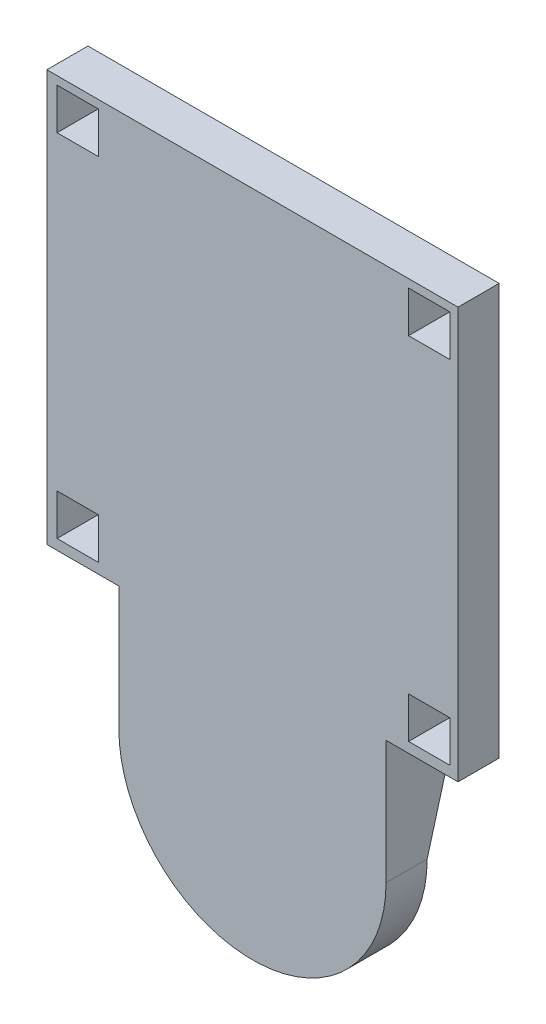
ISO-10303-21;
HEADER;
FILE_DESCRIPTION(('STEP AP214'),'2;1');
FILE_NAME('part.step','',(''),(''),'','','');
FILE_SCHEMA(('AUTOMOTIVE_DESIGN { 1 0 10303 214 1 1 1 1 }'));
ENDSEC;
DATA;
#1=APPLICATION_CONTEXT('core data for automotive mechanical design processes');
#2=APPLICATION_PROTOCOL_DEFINITION('international standard','automotive_design',2000,#1);
#3=PRODUCT_CONTEXT('',#1,'mechanical');
#4=PRODUCT('Part','Part','',(#3));
#5=PRODUCT_RELATED_PRODUCT_CATEGORY('part','',(#4));
#6=PRODUCT_DEFINITION_FORMATION('','',#4);
#7=PRODUCT_DEFINITION_CONTEXT('part definition',#1,'design');
#8=PRODUCT_DEFINITION('design','',#6,#7);
#9=PRODUCT_DEFINITION_SHAPE('','',#8);
#10=(LENGTH_UNIT() NAMED_UNIT(*) SI_UNIT(.MILLI.,.METRE.));
#11=(NAMED_UNIT(*) PLANE_ANGLE_UNIT() SI_UNIT($,.RADIAN.));
#12=(NAMED_UNIT(*) SI_UNIT($,.STERADIAN.) SOLID_ANGLE_UNIT());
#13=UNCERTAINTY_MEASURE_WITH_UNIT(LENGTH_MEASURE(1.E-05),#10,'distance_accuracy_value','');
#14=(GEOMETRIC_REPRESENTATION_CONTEXT(3) GLOBAL_UNCERTAINTY_ASSIGNED_CONTEXT((#13)) GLOBAL_UNIT_ASSIGNED_CONTEXT((#10,
#11,#12)) REPRESENTATION_CONTEXT('',''));
#15=CARTESIAN_POINT('',(0.,0.,0.));
#16=DIRECTION('',(0.,0.,1.));
#17=DIRECTION('',(1.,0.,0.));
#18=AXIS2_PLACEMENT_3D('',#15,#16,#17);
#19=CARTESIAN_POINT('',(-55.,-100.,6.));
#20=DIRECTION('',(-1.,0.,0.));
#21=DIRECTION('',(0.,0.,1.));
#22=AXIS2_PLACEMENT_3D('',#19,#20,#21);
#23=PLANE('',#22);
#24=DIRECTION('',(0.,0.770021560905562,-0.638017864750323));
#25=VECTOR('',#24,1.);
#26=CARTESIAN_POINT('',(-55.,-90.5,-23.));
#27=LINE('',#26,#25);
#28=CARTESIAN_POINT('',(-55.,-125.5,6.));
#29=VERTEX_POINT('',#28);
#30=CARTESIAN_POINT('',(-55.,-90.5,-23.));
#31=VERTEX_POINT('',#30);
#32=EDGE_CURVE('E63',#29,#31,#27,.T.);
#33=ORIENTED_EDGE('',*,*,#32,.F.);
#34=DIRECTION('',(0.,1.,0.));
#35=VECTOR('',#34,1.);
#36=CARTESIAN_POINT('',(-55.,-80.5,6.));
#37=LINE('',#36,#35);
#38=CARTESIAN_POINT('',(-55.,-160.,6.));
#39=VERTEX_POINT('',#38);
#40=EDGE_CURVE('E346',#39,#29,#37,.T.);
#41=ORIENTED_EDGE('',*,*,#40,.F.);
#42=DIRECTION('',(0.,0.,-1.));
#43=VECTOR('',#42,1.);
#44=CARTESIAN_POINT('',(-55.,-160.,6.));
#45=LINE('',#44,#43);
#46=CARTESIAN_POINT('',(-55.,-160.,-10.));
#47=VERTEX_POINT('',#46);
#48=EDGE_CURVE('E362',#39,#47,#45,.T.);
#49=ORIENTED_EDGE('',*,*,#48,.T.);
#50=DIRECTION('',(0.,0.963777975946711,-0.266705854978964));
#51=VECTOR('',#50,1.);
#52=CARTESIAN_POINT('',(-55.,-160.,-10.));
#53=LINE('',#52,#51);
#54=CARTESIAN_POINT('',(-55.,-90.5,-29.2327044025157));
#55=VERTEX_POINT('',#54);
#56=EDGE_CURVE('E287',#47,#55,#53,.T.);
#57=ORIENTED_EDGE('',*,*,#56,.T.);
#58=DIRECTION('',(0.,0.,1.));
#59=VECTOR('',#58,1.);
#60=CARTESIAN_POINT('',(-55.,-90.5,-32.));
#61=LINE('',#60,#59);
#62=EDGE_CURVE('E340',#55,#31,#61,.T.);
#63=ORIENTED_EDGE('',*,*,#62,.T.);
#64=EDGE_LOOP('',(#33,#41,#49,#57,#63));
#65=FACE_BOUND('',#64,.T.);
#66=ADVANCED_FACE('F39',(#65),#23,.F.);
#67=CARTESIAN_POINT('',(55.,-160.,6.));
#68=DIRECTION('',(1.,0.,0.));
#69=DIRECTION('',(0.,0.,-1.));
#70=AXIS2_PLACEMENT_3D('',#67,#68,#69);
#71=PLANE('',#70);
#72=DIRECTION('',(0.,-0.770021560905562,0.638017864750323));
#73=VECTOR('',#72,1.);
#74=CARTESIAN_POINT('',(55.,-145.956195546951,22.9494191674734));
#75=LINE('',#74,#73);
#76=CARTESIAN_POINT('',(55.,-90.5,-23.));
#77=VERTEX_POINT('',#76);
#78=CARTESIAN_POINT('',(55.,-125.5,6.));
#79=VERTEX_POINT('',#78);
#80=EDGE_CURVE('E268',#77,#79,#75,.T.);
#81=ORIENTED_EDGE('',*,*,#80,.F.);
#82=DIRECTION('',(0.,0.,1.));
#83=VECTOR('',#82,1.);
#84=CARTESIAN_POINT('',(55.,-90.5,-32.));
#85=LINE('',#84,#83);
#86=CARTESIAN_POINT('',(55.,-90.5,-29.2327044025157));
#87=VERTEX_POINT('',#86);
#88=EDGE_CURVE('E255',#87,#77,#85,.T.);
#89=ORIENTED_EDGE('',*,*,#88,.F.);
#90=DIRECTION('',(0.,0.963777975946711,-0.266705854978964));
#91=VECTOR('',#90,1.);
#92=CARTESIAN_POINT('',(55.,-160.,-10.));
#93=LINE('',#92,#91);
#94=CARTESIAN_POINT('',(55.,-160.,-10.));
#95=VERTEX_POINT('',#94);
#96=EDGE_CURVE('E310',#95,#87,#93,.T.);
#97=ORIENTED_EDGE('',*,*,#96,.F.);
#98=DIRECTION('',(0.,0.,-1.));
#99=VECTOR('',#98,1.);
#100=CARTESIAN_POINT('',(55.,-160.,6.));
#101=LINE('',#100,#99);
#102=CARTESIAN_POINT('',(55.,-160.,6.));
#103=VERTEX_POINT('',#102);
#104=EDGE_CURVE('E356',#103,#95,#101,.T.);
#105=ORIENTED_EDGE('',*,*,#104,.F.);
#106=DIRECTION('',(0.,-1.,0.));
#107=VECTOR('',#106,1.);
#108=CARTESIAN_POINT('',(55.,-100.,6.));
#109=LINE('',#108,#107);
#110=EDGE_CURVE('E271',#79,#103,#109,.T.);
#111=ORIENTED_EDGE('',*,*,#110,.F.);
#112=EDGE_LOOP('',(#81,#89,#97,#105,#111));
#113=FACE_BOUND('',#112,.T.);
#114=ADVANCED_FACE('F269',(#113),#71,.F.);
#115=CARTESIAN_POINT('',(0.,-160.,6.));
#116=DIRECTION('',(0.,0.,-1.));
#117=DIRECTION('',(-1.,0.,0.));
#118=AXIS2_PLACEMENT_3D('',#115,#116,#117);
#119=PLANE('',#118);
#120=ORIENTED_EDGE('',*,*,#40,.T.);
#121=DIRECTION('',(-1.,0.,0.));
#122=VECTOR('',#121,1.);
#123=CARTESIAN_POINT('',(65.,-125.5,6.));
#124=LINE('',#123,#122);
#125=EDGE_CURVE('E55',#79,#29,#124,.T.);
#126=ORIENTED_EDGE('',*,*,#125,.F.);
#127=ORIENTED_EDGE('',*,*,#110,.T.);
#128=CARTESIAN_POINT('',(0.,-160.,6.));
#129=DIRECTION('',(0.,0.,-1.));
#130=DIRECTION('',(-1.,0.,0.));
#131=AXIS2_PLACEMENT_3D('',#128,#129,#130);
#132=CIRCLE('',#131,55.);
#133=EDGE_CURVE('E352',#103,#39,#132,.T.);
#134=ORIENTED_EDGE('',*,*,#133,.T.);
#135=EDGE_LOOP('',(#120,#126,#127,#134));
#136=FACE_BOUND('',#135,.T.);
#137=ADVANCED_FACE('F693',(#136),#119,.T.);
#138=CARTESIAN_POINT('',(55.,-90.5,-32.));
#139=DIRECTION('',(0.,1.,0.));
#140=DIRECTION('',(0.,0.,1.));
#141=AXIS2_PLACEMENT_3D('',#138,#139,#140);
#142=PLANE('',#141);
#143=DIRECTION('',(1.,0.,0.));
#144=VECTOR('',#143,1.);
#145=CARTESIAN_POINT('',(55.,-90.5,-23.));
#146=LINE('',#145,#144);
#147=EDGE_CURVE('E11',#31,#77,#146,.T.);
#148=ORIENTED_EDGE('',*,*,#147,.F.);
#149=ORIENTED_EDGE('',*,*,#62,.F.);
#150=CARTESIAN_POINT('',(-55.,-90.5,-32.));
#151=VERTEX_POINT('',#150);
#152=EDGE_CURVE('E265',#151,#55,#61,.T.);
#153=ORIENTED_EDGE('',*,*,#152,.F.);
#154=DIRECTION('',(-1.,0.,0.));
#155=VECTOR('',#154,1.);
#156=CARTESIAN_POINT('',(55.,-90.5,-32.));
#157=LINE('',#156,#155);
#158=CARTESIAN_POINT('',(55.,-90.5,-32.));
#159=VERTEX_POINT('',#158);
#160=EDGE_CURVE('E333',#159,#151,#157,.T.);
#161=ORIENTED_EDGE('',*,*,#160,.F.);
#162=EDGE_CURVE('E260',#159,#87,#85,.T.);
#163=ORIENTED_EDGE('',*,*,#162,.T.);
#164=ORIENTED_EDGE('',*,*,#88,.T.);
#165=EDGE_LOOP('',(#148,#149,#153,#161,#163,#164));
#166=FACE_BOUND('',#165,.T.);
#167=ADVANCED_FACE('F257',(#166),#142,.F.);
#168=CARTESIAN_POINT('',(0.,0.,-10.));
#169=DIRECTION('',(0.,0.,-1.));
#170=DIRECTION('',(-1.,0.,0.));
#171=AXIS2_PLACEMENT_3D('',#168,#169,#170);
#172=PLANE('',#171);
#173=DIRECTION('',(1.,0.,0.));
#174=VECTOR('',#173,1.);
#175=CARTESIAN_POINT('',(-65.,-160.,-10.));
#176=LINE('',#175,#174);
#177=CARTESIAN_POINT('',(-65.,-160.,-10.));
#178=VERTEX_POINT('',#177);
#179=EDGE_CURVE('E300',#178,#47,#176,.T.);
#180=ORIENTED_EDGE('',*,*,#179,.T.);
#181=CARTESIAN_POINT('',(0.,-160.,-10.));
#182=DIRECTION('',(0.,0.,-1.));
#183=DIRECTION('',(-1.,0.,0.));
#184=AXIS2_PLACEMENT_3D('',#181,#182,#183);
#185=CIRCLE('',#184,55.);
#186=EDGE_CURVE('E349',#95,#47,#185,.T.);
#187=ORIENTED_EDGE('',*,*,#186,.F.);
#188=DIRECTION('',(-1.,0.,0.));
#189=VECTOR('',#188,1.);
#190=CARTESIAN_POINT('',(65.,-160.,-10.));
#191=LINE('',#190,#189);
#192=CARTESIAN_POINT('',(65.,-160.,-10.));
#193=VERTEX_POINT('',#192);
#194=EDGE_CURVE('E317',#193,#95,#191,.T.);
#195=ORIENTED_EDGE('',*,*,#194,.F.);
#196=CARTESIAN_POINT('',(0.,-160.,-10.));
#197=DIRECTION('',(0.,0.,-1.));
#198=DIRECTION('',(-1.,0.,0.));
#199=AXIS2_PLACEMENT_3D('',#196,#197,#198);
#200=CIRCLE('',#199,65.);
#201=EDGE_CURVE('E366',#193,#178,#200,.T.);
#202=ORIENTED_EDGE('',*,*,#201,.T.);
#203=EDGE_LOOP('',(#180,#187,#195,#202));
#204=FACE_BOUND('',#203,.T.);
#205=ADVANCED_FACE('F687',(#204),#172,.T.);
#206=DIRECTION('',(1.,0.,0.));
#207=VECTOR('',#206,1.);
#208=CARTESIAN_POINT('',(55.,-80.5,-10.));
#209=LINE('',#208,#207);
#210=CARTESIAN_POINT('',(-65.,-80.5,-10.));
#211=VERTEX_POINT('',#210);
#212=CARTESIAN_POINT('',(65.,-80.5,-10.));
#213=VERTEX_POINT('',#212);
#214=EDGE_CURVE('E345',#211,#213,#209,.T.);
#215=ORIENTED_EDGE('',*,*,#214,.F.);
#216=DIRECTION('',(0.,-1.,0.));
#217=VECTOR('',#216,1.);
#218=CARTESIAN_POINT('',(-65.,-80.5,-10.));
#219=LINE('',#218,#217);
#220=CARTESIAN_POINT('',(-65.,-100.,-10.));
#221=VERTEX_POINT('',#220);
#222=EDGE_CURVE('E286',#211,#221,#219,.T.);
#223=ORIENTED_EDGE('',*,*,#222,.T.);
#224=DIRECTION('',(1.,0.,0.));
#225=VECTOR('',#224,1.);
#226=CARTESIAN_POINT('',(-100.,-100.,-10.));
#227=LINE('',#226,#225);
#228=CARTESIAN_POINT('',(-100.,-100.,-10.));
#229=VERTEX_POINT('',#228);
#230=EDGE_CURVE('E582',#229,#221,#227,.T.);
#231=ORIENTED_EDGE('',*,*,#230,.F.);
#232=DIRECTION('',(0.,-1.,0.));
#233=VECTOR('',#232,1.);
#234=CARTESIAN_POINT('',(-100.,-100.,-10.));
#235=LINE('',#234,#233);
#236=CARTESIAN_POINT('',(-100.,100.,-10.));
#237=VERTEX_POINT('',#236);
#238=EDGE_CURVE('E600',#237,#229,#235,.T.);
#239=ORIENTED_EDGE('',*,*,#238,.F.);
#240=DIRECTION('',(-1.,0.,0.));
#241=VECTOR('',#240,1.);
#242=CARTESIAN_POINT('',(-100.,100.,-10.));
#243=LINE('',#242,#241);
#244=CARTESIAN_POINT('',(100.,100.,-10.));
#245=VERTEX_POINT('',#244);
#246=EDGE_CURVE('E597',#245,#237,#243,.T.);
#247=ORIENTED_EDGE('',*,*,#246,.F.);
#248=DIRECTION('',(0.,1.,0.));
#249=VECTOR('',#248,1.);
#250=CARTESIAN_POINT('',(100.,-100.,-10.));
#251=LINE('',#250,#249);
#252=CARTESIAN_POINT('',(100.,-100.,-10.));
#253=VERTEX_POINT('',#252);
#254=EDGE_CURVE('E576',#253,#245,#251,.T.);
#255=ORIENTED_EDGE('',*,*,#254,.F.);
#256=CARTESIAN_POINT('',(65.,-100.,-10.));
#257=VERTEX_POINT('',#256);
#258=EDGE_CURVE('E603',#257,#253,#227,.T.);
#259=ORIENTED_EDGE('',*,*,#258,.F.);
#260=DIRECTION('',(0.,-1.,0.));
#261=VECTOR('',#260,1.);
#262=CARTESIAN_POINT('',(65.,-80.5,-10.));
#263=LINE('',#262,#261);
#264=EDGE_CURVE('E314',#213,#257,#263,.T.);
#265=ORIENTED_EDGE('',*,*,#264,.F.);
#266=EDGE_LOOP('',(#215,#223,#231,#239,#247,#255,#259,#265));
#267=FACE_BOUND('',#266,.T.);
#268=DIRECTION('',(0.,1.,0.));
#269=VECTOR('',#268,1.);
#270=CARTESIAN_POINT('',(75.95,-95.,-10.));
#271=LINE('',#270,#269);
#272=CARTESIAN_POINT('',(75.95,-95.,-10.));
#273=VERTEX_POINT('',#272);
#274=CARTESIAN_POINT('',(75.95,-74.95,-10.));
#275=VERTEX_POINT('',#274);
#276=EDGE_CURVE('E400',#273,#275,#271,.T.);
#277=ORIENTED_EDGE('',*,*,#276,.F.);
#278=DIRECTION('',(-1.,0.,0.));
#279=VECTOR('',#278,1.);
#280=CARTESIAN_POINT('',(96.,-95.,-10.));
#281=LINE('',#280,#279);
#282=CARTESIAN_POINT('',(96.,-95.,-10.));
#283=VERTEX_POINT('',#282);
#284=EDGE_CURVE('E469',#283,#273,#281,.T.);
#285=ORIENTED_EDGE('',*,*,#284,.F.);
#286=DIRECTION('',(0.,-1.,0.));
#287=VECTOR('',#286,1.);
#288=CARTESIAN_POINT('',(96.,-95.,-10.));
#289=LINE('',#288,#287);
#290=CARTESIAN_POINT('',(96.,-74.95,-10.));
#291=VERTEX_POINT('',#290);
#292=EDGE_CURVE('E465',#291,#283,#289,.T.);
#293=ORIENTED_EDGE('',*,*,#292,.F.);
#294=DIRECTION('',(1.,0.,0.));
#295=VECTOR('',#294,1.);
#296=CARTESIAN_POINT('',(96.,-74.95,-10.));
#297=LINE('',#296,#295);
#298=EDGE_CURVE('E461',#275,#291,#297,.T.);
#299=ORIENTED_EDGE('',*,*,#298,.F.);
#300=EDGE_LOOP('',(#277,#285,#293,#299));
#301=FACE_BOUND('',#300,.T.);
#302=DIRECTION('',(0.,-1.,0.));
#303=VECTOR('',#302,1.);
#304=CARTESIAN_POINT('',(-75.,-95.,-10.));
#305=LINE('',#304,#303);
#306=CARTESIAN_POINT('',(-75.,-74.95,-10.));
#307=VERTEX_POINT('',#306);
#308=CARTESIAN_POINT('',(-75.,-95.,-10.));
#309=VERTEX_POINT('',#308);
#310=EDGE_CURVE('E431',#307,#309,#305,.T.);
#311=ORIENTED_EDGE('',*,*,#310,.F.);
#312=DIRECTION('',(1.,0.,0.));
#313=VECTOR('',#312,1.);
#314=CARTESIAN_POINT('',(-95.05,-74.95,-10.));
#315=LINE('',#314,#313);
#316=CARTESIAN_POINT('',(-95.05,-74.95,-10.));
#317=VERTEX_POINT('',#316);
#318=EDGE_CURVE('E443',#317,#307,#315,.T.);
#319=ORIENTED_EDGE('',*,*,#318,.F.);
#320=DIRECTION('',(0.,1.,0.));
#321=VECTOR('',#320,1.);
#322=CARTESIAN_POINT('',(-95.05,-95.,-10.));
#323=LINE('',#322,#321);
#324=CARTESIAN_POINT('',(-95.05,-95.,-10.));
#325=VERTEX_POINT('',#324);
#326=EDGE_CURVE('E439',#325,#317,#323,.T.);
#327=ORIENTED_EDGE('',*,*,#326,.F.);
#328=DIRECTION('',(-1.,0.,0.));
#329=VECTOR('',#328,1.);
#330=CARTESIAN_POINT('',(-95.05,-95.,-10.));
#331=LINE('',#330,#329);
#332=EDGE_CURVE('E434',#309,#325,#331,.T.);
#333=ORIENTED_EDGE('',*,*,#332,.F.);
#334=EDGE_LOOP('',(#311,#319,#327,#333));
#335=FACE_BOUND('',#334,.T.);
#336=DIRECTION('',(0.,1.,0.));
#337=VECTOR('',#336,1.);
#338=CARTESIAN_POINT('',(-95.05,75.95,-10.));
#339=LINE('',#338,#337);
#340=CARTESIAN_POINT('',(-95.05,75.95,-10.));
#341=VERTEX_POINT('',#340);
#342=CARTESIAN_POINT('',(-95.05,96.,-10.));
#343=VERTEX_POINT('',#342);
#344=EDGE_CURVE('E401',#341,#343,#339,.T.);
#345=ORIENTED_EDGE('',*,*,#344,.F.);
#346=DIRECTION('',(-1.,0.,0.));
#347=VECTOR('',#346,1.);
#348=CARTESIAN_POINT('',(-75.,75.95,-10.));
#349=LINE('',#348,#347);
#350=CARTESIAN_POINT('',(-75.,75.95,-10.));
#351=VERTEX_POINT('',#350);
#352=EDGE_CURVE('E413',#351,#341,#349,.T.);
#353=ORIENTED_EDGE('',*,*,#352,.F.);
#354=DIRECTION('',(0.,-1.,0.));
#355=VECTOR('',#354,1.);
#356=CARTESIAN_POINT('',(-75.,75.95,-10.));
#357=LINE('',#356,#355);
#358=CARTESIAN_POINT('',(-75.,96.,-10.));
#359=VERTEX_POINT('',#358);
#360=EDGE_CURVE('E409',#359,#351,#357,.T.);
#361=ORIENTED_EDGE('',*,*,#360,.F.);
#362=DIRECTION('',(1.,0.,0.));
#363=VECTOR('',#362,1.);
#364=CARTESIAN_POINT('',(-75.,96.,-10.));
#365=LINE('',#364,#363);
#366=EDGE_CURVE('E404',#343,#359,#365,.T.);
#367=ORIENTED_EDGE('',*,*,#366,.F.);
#368=EDGE_LOOP('',(#345,#353,#361,#367));
#369=FACE_BOUND('',#368,.T.);
#370=DIRECTION('',(0.,-1.,0.));
#371=VECTOR('',#370,1.);
#372=CARTESIAN_POINT('',(96.,75.95,-10.));
#373=LINE('',#372,#371);
#374=CARTESIAN_POINT('',(96.,96.,-10.));
#375=VERTEX_POINT('',#374);
#376=CARTESIAN_POINT('',(96.,75.95,-10.));
#377=VERTEX_POINT('',#376);
#378=EDGE_CURVE('E421',#375,#377,#373,.T.);
#379=ORIENTED_EDGE('',*,*,#378,.F.);
#380=DIRECTION('',(1.,0.,0.));
#381=VECTOR('',#380,1.);
#382=CARTESIAN_POINT('',(75.95,96.,-10.));
#383=LINE('',#382,#381);
#384=CARTESIAN_POINT('',(75.95,96.,-10.));
#385=VERTEX_POINT('',#384);
#386=EDGE_CURVE('E495',#385,#375,#383,.T.);
#387=ORIENTED_EDGE('',*,*,#386,.F.);
#388=DIRECTION('',(0.,1.,0.));
#389=VECTOR('',#388,1.);
#390=CARTESIAN_POINT('',(75.95,75.95,-10.));
#391=LINE('',#390,#389);
#392=CARTESIAN_POINT('',(75.95,75.95,-10.));
#393=VERTEX_POINT('',#392);
#394=EDGE_CURVE('E491',#393,#385,#391,.T.);
#395=ORIENTED_EDGE('',*,*,#394,.F.);
#396=DIRECTION('',(-1.,0.,0.));
#397=VECTOR('',#396,1.);
#398=CARTESIAN_POINT('',(75.95,75.95,-10.));
#399=LINE('',#398,#397);
#400=EDGE_CURVE('E487',#377,#393,#399,.T.);
#401=ORIENTED_EDGE('',*,*,#400,.F.);
#402=EDGE_LOOP('',(#379,#387,#395,#401));
#403=FACE_BOUND('',#402,.T.);
#404=ADVANCED_FACE('F629',(#267,#301,#335,#369,#403),#172,.T.);
#405=CARTESIAN_POINT('',(55.,-80.5,-32.));
#406=DIRECTION('',(-1.,0.,0.));
#407=DIRECTION('',(0.,0.,1.));
#408=AXIS2_PLACEMENT_3D('',#405,#406,#407);
#409=PLANE('',#408);
#410=CARTESIAN_POINT('',(55.,-80.5,-32.));
#411=VERTEX_POINT('',#410);
#412=EDGE_CURVE('E304',#87,#411,#93,.T.);
#413=ORIENTED_EDGE('',*,*,#412,.F.);
#414=ORIENTED_EDGE('',*,*,#162,.F.);
#415=DIRECTION('',(0.,-1.,0.));
#416=VECTOR('',#415,1.);
#417=CARTESIAN_POINT('',(55.,-80.5,-32.));
#418=LINE('',#417,#416);
#419=EDGE_CURVE('E330',#411,#159,#418,.T.);
#420=ORIENTED_EDGE('',*,*,#419,.F.);
#421=EDGE_LOOP('',(#413,#414,#420));
#422=FACE_BOUND('',#421,.T.);
#423=ADVANCED_FACE('F682',(#422),#409,.F.);
#424=CARTESIAN_POINT('',(-100.,-100.,10.));
#425=DIRECTION('',(0.,1.,0.));
#426=DIRECTION('',(0.,0.,1.));
#427=AXIS2_PLACEMENT_3D('',#424,#425,#426);
#428=PLANE('',#427);
#429=DIRECTION('',(0.,0.,1.));
#430=VECTOR('',#429,1.);
#431=CARTESIAN_POINT('',(65.,-100.,-9.99999999999997));
#432=LINE('',#431,#430);
#433=CARTESIAN_POINT('',(65.,-100.,10.));
#434=VERTEX_POINT('',#433);
#435=EDGE_CURVE('E374',#257,#434,#432,.T.);
#436=ORIENTED_EDGE('',*,*,#435,.F.);
#437=ORIENTED_EDGE('',*,*,#258,.T.);
#438=DIRECTION('',(0.,0.,-1.));
#439=VECTOR('',#438,1.);
#440=CARTESIAN_POINT('',(100.,-100.,10.));
#441=LINE('',#440,#439);
#442=CARTESIAN_POINT('',(100.,-100.,10.));
#443=VERTEX_POINT('',#442);
#444=EDGE_CURVE('E593',#443,#253,#441,.T.);
#445=ORIENTED_EDGE('',*,*,#444,.F.);
#446=DIRECTION('',(1.,0.,0.));
#447=VECTOR('',#446,1.);
#448=CARTESIAN_POINT('',(-100.,-100.,10.));
#449=LINE('',#448,#447);
#450=EDGE_CURVE('E588',#434,#443,#449,.T.);
#451=ORIENTED_EDGE('',*,*,#450,.F.);
#452=EDGE_LOOP('',(#436,#437,#445,#451));
#453=FACE_BOUND('',#452,.T.);
#454=ADVANCED_FACE('F659',(#453),#428,.F.);
#455=DIRECTION('',(0.,0.,-1.));
#456=VECTOR('',#455,1.);
#457=CARTESIAN_POINT('',(-65.,-100.,9.99999999999998));
#458=LINE('',#457,#456);
#459=CARTESIAN_POINT('',(-65.,-100.,10.));
#460=VERTEX_POINT('',#459);
#461=EDGE_CURVE('E383',#460,#221,#458,.T.);
#462=ORIENTED_EDGE('',*,*,#461,.F.);
#463=CARTESIAN_POINT('',(-100.,-100.,10.));
#464=VERTEX_POINT('',#463);
#465=EDGE_CURVE('E589',#464,#460,#449,.T.);
#466=ORIENTED_EDGE('',*,*,#465,.F.);
#467=DIRECTION('',(0.,0.,-1.));
#468=VECTOR('',#467,1.);
#469=CARTESIAN_POINT('',(-100.,-100.,10.));
#470=LINE('',#469,#468);
#471=EDGE_CURVE('E610',#464,#229,#470,.T.);
#472=ORIENTED_EDGE('',*,*,#471,.T.);
#473=ORIENTED_EDGE('',*,*,#230,.T.);
#474=EDGE_LOOP('',(#462,#466,#472,#473));
#475=FACE_BOUND('',#474,.T.);
#476=ADVANCED_FACE('F640',(#475),#428,.F.);
#477=CARTESIAN_POINT('',(100.,-100.,10.));
#478=DIRECTION('',(-1.,0.,0.));
#479=DIRECTION('',(0.,0.,1.));
#480=AXIS2_PLACEMENT_3D('',#477,#478,#479);
#481=PLANE('',#480);
#482=ORIENTED_EDGE('',*,*,#254,.T.);
#483=DIRECTION('',(0.,0.,-1.));
#484=VECTOR('',#483,1.);
#485=CARTESIAN_POINT('',(100.,100.,10.));
#486=LINE('',#485,#484);
#487=CARTESIAN_POINT('',(100.,100.,10.));
#488=VERTEX_POINT('',#487);
#489=EDGE_CURVE('E48',#488,#245,#486,.T.);
#490=ORIENTED_EDGE('',*,*,#489,.F.);
#491=DIRECTION('',(0.,1.,0.));
#492=VECTOR('',#491,1.);
#493=CARTESIAN_POINT('',(100.,-100.,10.));
#494=LINE('',#493,#492);
#495=EDGE_CURVE('E577',#443,#488,#494,.T.);
#496=ORIENTED_EDGE('',*,*,#495,.F.);
#497=ORIENTED_EDGE('',*,*,#444,.T.);
#498=EDGE_LOOP('',(#482,#490,#496,#497));
#499=FACE_BOUND('',#498,.T.);
#500=ADVANCED_FACE('F41',(#499),#481,.F.);
#501=CARTESIAN_POINT('',(-100.,100.,10.));
#502=DIRECTION('',(0.,-1.,0.));
#503=DIRECTION('',(0.,0.,-1.));
#504=AXIS2_PLACEMENT_3D('',#501,#502,#503);
#505=PLANE('',#504);
#506=ORIENTED_EDGE('',*,*,#246,.T.);
#507=DIRECTION('',(0.,0.,-1.));
#508=VECTOR('',#507,1.);
#509=CARTESIAN_POINT('',(-100.,100.,10.));
#510=LINE('',#509,#508);
#511=CARTESIAN_POINT('',(-100.,100.,10.));
#512=VERTEX_POINT('',#511);
#513=EDGE_CURVE('E614',#512,#237,#510,.T.);
#514=ORIENTED_EDGE('',*,*,#513,.F.);
#515=DIRECTION('',(-1.,0.,0.));
#516=VECTOR('',#515,1.);
#517=CARTESIAN_POINT('',(-100.,100.,10.));
#518=LINE('',#517,#516);
#519=EDGE_CURVE('E581',#488,#512,#518,.T.);
#520=ORIENTED_EDGE('',*,*,#519,.F.);
#521=ORIENTED_EDGE('',*,*,#489,.T.);
#522=EDGE_LOOP('',(#506,#514,#520,#521));
#523=FACE_BOUND('',#522,.T.);
#524=ADVANCED_FACE('F621',(#523),#505,.F.);
#525=CARTESIAN_POINT('',(-100.,-100.,10.));
#526=DIRECTION('',(1.,0.,0.));
#527=DIRECTION('',(0.,0.,-1.));
#528=AXIS2_PLACEMENT_3D('',#525,#526,#527);
#529=PLANE('',#528);
#530=ORIENTED_EDGE('',*,*,#238,.T.);
#531=ORIENTED_EDGE('',*,*,#471,.F.);
#532=DIRECTION('',(0.,-1.,0.));
#533=VECTOR('',#532,1.);
#534=CARTESIAN_POINT('',(-100.,-100.,10.));
#535=LINE('',#534,#533);
#536=EDGE_CURVE('E585',#512,#464,#535,.T.);
#537=ORIENTED_EDGE('',*,*,#536,.F.);
#538=ORIENTED_EDGE('',*,*,#513,.T.);
#539=EDGE_LOOP('',(#530,#531,#537,#538));
#540=FACE_BOUND('',#539,.T.);
#541=ADVANCED_FACE('F636',(#540),#529,.F.);
#542=CARTESIAN_POINT('',(0.,0.,10.));
#543=DIRECTION('',(0.,0.,-1.));
#544=DIRECTION('',(-1.,0.,0.));
#545=AXIS2_PLACEMENT_3D('',#542,#543,#544);
#546=PLANE('',#545);
#547=DIRECTION('',(-1.,0.,0.));
#548=VECTOR('',#547,1.);
#549=CARTESIAN_POINT('',(0.,-95.,10.));
#550=LINE('',#549,#548);
#551=CARTESIAN_POINT('',(96.,-95.,10.));
#552=VERTEX_POINT('',#551);
#553=CARTESIAN_POINT('',(75.95,-95.,10.));
#554=VERTEX_POINT('',#553);
#555=EDGE_CURVE('E568',#552,#554,#550,.T.);
#556=ORIENTED_EDGE('',*,*,#555,.T.);
#557=DIRECTION('',(0.,1.,0.));
#558=VECTOR('',#557,1.);
#559=CARTESIAN_POINT('',(75.95,0.,10.));
#560=LINE('',#559,#558);
#561=CARTESIAN_POINT('',(75.95,-74.95,10.));
#562=VERTEX_POINT('',#561);
#563=EDGE_CURVE('E572',#554,#562,#560,.T.);
#564=ORIENTED_EDGE('',*,*,#563,.T.);
#565=DIRECTION('',(1.,0.,0.));
#566=VECTOR('',#565,1.);
#567=CARTESIAN_POINT('',(0.,-74.95,10.));
#568=LINE('',#567,#566);
#569=CARTESIAN_POINT('',(96.,-74.95,10.));
#570=VERTEX_POINT('',#569);
#571=EDGE_CURVE('E560',#562,#570,#568,.T.);
#572=ORIENTED_EDGE('',*,*,#571,.T.);
#573=DIRECTION('',(0.,-1.,0.));
#574=VECTOR('',#573,1.);
#575=CARTESIAN_POINT('',(96.,0.,10.));
#576=LINE('',#575,#574);
#577=EDGE_CURVE('E564',#570,#552,#576,.T.);
#578=ORIENTED_EDGE('',*,*,#577,.T.);
#579=EDGE_LOOP('',(#556,#564,#572,#578));
#580=FACE_BOUND('',#579,.T.);
#581=DIRECTION('',(1.,0.,0.));
#582=VECTOR('',#581,1.);
#583=CARTESIAN_POINT('',(0.,-74.95,10.));
#584=LINE('',#583,#582);
#585=CARTESIAN_POINT('',(-95.05,-74.95,10.));
#586=VERTEX_POINT('',#585);
#587=CARTESIAN_POINT('',(-75.,-74.95,10.));
#588=VERTEX_POINT('',#587);
#589=EDGE_CURVE('E552',#586,#588,#584,.T.);
#590=ORIENTED_EDGE('',*,*,#589,.T.);
#591=DIRECTION('',(0.,-1.,0.));
#592=VECTOR('',#591,1.);
#593=CARTESIAN_POINT('',(-75.,0.,10.));
#594=LINE('',#593,#592);
#595=CARTESIAN_POINT('',(-75.,-95.,10.));
#596=VERTEX_POINT('',#595);
#597=EDGE_CURVE('E556',#588,#596,#594,.T.);
#598=ORIENTED_EDGE('',*,*,#597,.T.);
#599=DIRECTION('',(-1.,0.,0.));
#600=VECTOR('',#599,1.);
#601=CARTESIAN_POINT('',(0.,-95.,10.));
#602=LINE('',#601,#600);
#603=CARTESIAN_POINT('',(-95.05,-95.,10.));
#604=VERTEX_POINT('',#603);
#605=EDGE_CURVE('E544',#596,#604,#602,.T.);
#606=ORIENTED_EDGE('',*,*,#605,.T.);
#607=DIRECTION('',(0.,1.,0.));
#608=VECTOR('',#607,1.);
#609=CARTESIAN_POINT('',(-95.05,0.,10.));
#610=LINE('',#609,#608);
#611=EDGE_CURVE('E548',#604,#586,#610,.T.);
#612=ORIENTED_EDGE('',*,*,#611,.T.);
#613=EDGE_LOOP('',(#590,#598,#606,#612));
#614=FACE_BOUND('',#613,.T.);
#615=DIRECTION('',(-1.,0.,0.));
#616=VECTOR('',#615,1.);
#617=CARTESIAN_POINT('',(0.,75.95,10.));
#618=LINE('',#617,#616);
#619=CARTESIAN_POINT('',(-75.,75.95,10.));
#620=VERTEX_POINT('',#619);
#621=CARTESIAN_POINT('',(-95.05,75.95,10.));
#622=VERTEX_POINT('',#621);
#623=EDGE_CURVE('E536',#620,#622,#618,.T.);
#624=ORIENTED_EDGE('',*,*,#623,.T.);
#625=DIRECTION('',(0.,1.,0.));
#626=VECTOR('',#625,1.);
#627=CARTESIAN_POINT('',(-95.05,0.,10.));
#628=LINE('',#627,#626);
#629=CARTESIAN_POINT('',(-95.05,96.,10.));
#630=VERTEX_POINT('',#629);
#631=EDGE_CURVE('E540',#622,#630,#628,.T.);
#632=ORIENTED_EDGE('',*,*,#631,.T.);
#633=DIRECTION('',(1.,0.,0.));
#634=VECTOR('',#633,1.);
#635=CARTESIAN_POINT('',(0.,96.,10.));
#636=LINE('',#635,#634);
#637=CARTESIAN_POINT('',(-75.,96.,10.));
#638=VERTEX_POINT('',#637);
#639=EDGE_CURVE('E528',#630,#638,#636,.T.);
#640=ORIENTED_EDGE('',*,*,#639,.T.);
#641=DIRECTION('',(0.,-1.,0.));
#642=VECTOR('',#641,1.);
#643=CARTESIAN_POINT('',(-75.,0.,10.));
#644=LINE('',#643,#642);
#645=EDGE_CURVE('E532',#638,#620,#644,.T.);
#646=ORIENTED_EDGE('',*,*,#645,.T.);
#647=EDGE_LOOP('',(#624,#632,#640,#646));
#648=FACE_BOUND('',#647,.T.);
#649=DIRECTION('',(1.,0.,0.));
#650=VECTOR('',#649,1.);
#651=CARTESIAN_POINT('',(0.,96.0000000000001,10.));
#652=LINE('',#651,#650);
#653=CARTESIAN_POINT('',(75.95,96.,10.));
#654=VERTEX_POINT('',#653);
#655=CARTESIAN_POINT('',(96.,96.,10.));
#656=VERTEX_POINT('',#655);
#657=EDGE_CURVE('E520',#654,#656,#652,.T.);
#658=ORIENTED_EDGE('',*,*,#657,.T.);
#659=DIRECTION('',(0.,-1.,0.));
#660=VECTOR('',#659,1.);
#661=CARTESIAN_POINT('',(96.,0.,10.));
#662=LINE('',#661,#660);
#663=CARTESIAN_POINT('',(96.,75.95,10.));
#664=VERTEX_POINT('',#663);
#665=EDGE_CURVE('E524',#656,#664,#662,.T.);
#666=ORIENTED_EDGE('',*,*,#665,.T.);
#667=DIRECTION('',(-1.,0.,0.));
#668=VECTOR('',#667,1.);
#669=CARTESIAN_POINT('',(0.,75.95,10.));
#670=LINE('',#669,#668);
#671=CARTESIAN_POINT('',(75.95,75.95,10.));
#672=VERTEX_POINT('',#671);
#673=EDGE_CURVE('E503',#664,#672,#670,.T.);
#674=ORIENTED_EDGE('',*,*,#673,.T.);
#675=DIRECTION('',(0.,1.,0.));
#676=VECTOR('',#675,1.);
#677=CARTESIAN_POINT('',(75.95,0.,10.));
#678=LINE('',#677,#676);
#679=EDGE_CURVE('E516',#672,#654,#678,.T.);
#680=ORIENTED_EDGE('',*,*,#679,.T.);
#681=EDGE_LOOP('',(#658,#666,#674,#680));
#682=FACE_BOUND('',#681,.T.);
#683=ORIENTED_EDGE('',*,*,#495,.T.);
#684=ORIENTED_EDGE('',*,*,#519,.T.);
#685=ORIENTED_EDGE('',*,*,#536,.T.);
#686=ORIENTED_EDGE('',*,*,#465,.T.);
#687=DIRECTION('',(0.,1.,0.));
#688=VECTOR('',#687,1.);
#689=CARTESIAN_POINT('',(-65.,-160.,9.99999999999998));
#690=LINE('',#689,#688);
#691=CARTESIAN_POINT('',(-65.,-160.,9.99999999999998));
#692=VERTEX_POINT('',#691);
#693=EDGE_CURVE('E387',#692,#460,#690,.T.);
#694=ORIENTED_EDGE('',*,*,#693,.F.);
#695=CARTESIAN_POINT('',(0.,-160.,10.));
#696=DIRECTION('',(0.,0.,-1.));
#697=DIRECTION('',(-1.,0.,0.));
#698=AXIS2_PLACEMENT_3D('',#695,#696,#697);
#699=CIRCLE('',#698,65.);
#700=CARTESIAN_POINT('',(65.,-160.,10.));
#701=VERTEX_POINT('',#700);
#702=EDGE_CURVE('E370',#701,#692,#699,.T.);
#703=ORIENTED_EDGE('',*,*,#702,.F.);
#704=DIRECTION('',(0.,1.,0.));
#705=VECTOR('',#704,1.);
#706=CARTESIAN_POINT('',(65.,-160.,10.));
#707=LINE('',#706,#705);
#708=EDGE_CURVE('E396',#701,#434,#707,.T.);
#709=ORIENTED_EDGE('',*,*,#708,.T.);
#710=ORIENTED_EDGE('',*,*,#450,.T.);
#711=EDGE_LOOP('',(#683,#684,#685,#686,#694,#703,#709,#710));
#712=FACE_BOUND('',#711,.T.);
#713=ADVANCED_FACE('F642',(#580,#614,#648,#682,#712),#546,.F.);
#714=CARTESIAN_POINT('',(96.,75.95,30.));
#715=DIRECTION('',(1.,0.,0.));
#716=DIRECTION('',(0.,0.,-1.));
#717=AXIS2_PLACEMENT_3D('',#714,#715,#716);
#718=PLANE('',#717);
#719=DIRECTION('',(0.,0.,-1.));
#720=VECTOR('',#719,1.);
#721=CARTESIAN_POINT('',(96.,96.,30.));
#722=LINE('',#721,#720);
#723=EDGE_CURVE('E500',#656,#375,#722,.T.);
#724=ORIENTED_EDGE('',*,*,#723,.T.);
#725=ORIENTED_EDGE('',*,*,#378,.T.);
#726=DIRECTION('',(0.,0.,-1.));
#727=VECTOR('',#726,1.);
#728=CARTESIAN_POINT('',(96.,75.95,30.));
#729=LINE('',#728,#727);
#730=EDGE_CURVE('E499',#664,#377,#729,.T.);
#731=ORIENTED_EDGE('',*,*,#730,.F.);
#732=ORIENTED_EDGE('',*,*,#665,.F.);
#733=EDGE_LOOP('',(#724,#725,#731,#732));
#734=FACE_BOUND('',#733,.T.);
#735=ADVANCED_FACE('F769',(#734),#718,.F.);
#736=CARTESIAN_POINT('',(75.95,96.,30.));
#737=DIRECTION('',(0.,1.,0.));
#738=DIRECTION('',(-1.,0.,0.));
#739=AXIS2_PLACEMENT_3D('',#736,#737,#738);
#740=PLANE('',#739);
#741=DIRECTION('',(0.,0.,-1.));
#742=VECTOR('',#741,1.);
#743=CARTESIAN_POINT('',(75.95,96.,30.));
#744=LINE('',#743,#742);
#745=EDGE_CURVE('E504',#654,#385,#744,.T.);
#746=ORIENTED_EDGE('',*,*,#745,.T.);
#747=ORIENTED_EDGE('',*,*,#386,.T.);
#748=ORIENTED_EDGE('',*,*,#723,.F.);
#749=ORIENTED_EDGE('',*,*,#657,.F.);
#750=EDGE_LOOP('',(#746,#747,#748,#749));
#751=FACE_BOUND('',#750,.T.);
#752=ADVANCED_FACE('F765',(#751),#740,.F.);
#753=CARTESIAN_POINT('',(75.95,75.95,30.));
#754=DIRECTION('',(-1.,0.,0.));
#755=DIRECTION('',(0.,0.,1.));
#756=AXIS2_PLACEMENT_3D('',#753,#754,#755);
#757=PLANE('',#756);
#758=DIRECTION('',(0.,0.,-1.));
#759=VECTOR('',#758,1.);
#760=CARTESIAN_POINT('',(75.95,75.95,30.));
#761=LINE('',#760,#759);
#762=EDGE_CURVE('E507',#672,#393,#761,.T.);
#763=ORIENTED_EDGE('',*,*,#762,.T.);
#764=ORIENTED_EDGE('',*,*,#394,.T.);
#765=ORIENTED_EDGE('',*,*,#745,.F.);
#766=ORIENTED_EDGE('',*,*,#679,.F.);
#767=EDGE_LOOP('',(#763,#764,#765,#766));
#768=FACE_BOUND('',#767,.T.);
#769=ADVANCED_FACE('F768',(#768),#757,.F.);
#770=CARTESIAN_POINT('',(75.95,75.95,30.));
#771=DIRECTION('',(0.,-1.,0.));
#772=DIRECTION('',(0.,0.,-1.));
#773=AXIS2_PLACEMENT_3D('',#770,#771,#772);
#774=PLANE('',#773);
#775=ORIENTED_EDGE('',*,*,#730,.T.);
#776=ORIENTED_EDGE('',*,*,#400,.T.);
#777=ORIENTED_EDGE('',*,*,#762,.F.);
#778=ORIENTED_EDGE('',*,*,#673,.F.);
#779=EDGE_LOOP('',(#775,#776,#777,#778));
#780=FACE_BOUND('',#779,.T.);
#781=ADVANCED_FACE('F733',(#780),#774,.F.);
#782=CARTESIAN_POINT('',(-95.05,75.95,30.));
#783=DIRECTION('',(-1.,0.,0.));
#784=DIRECTION('',(0.,0.,1.));
#785=AXIS2_PLACEMENT_3D('',#782,#783,#784);
#786=PLANE('',#785);
#787=DIRECTION('',(0.,0.,-1.));
#788=VECTOR('',#787,1.);
#789=CARTESIAN_POINT('',(-95.05,75.95,30.));
#790=LINE('',#789,#788);
#791=EDGE_CURVE('E418',#622,#341,#790,.T.);
#792=ORIENTED_EDGE('',*,*,#791,.T.);
#793=ORIENTED_EDGE('',*,*,#344,.T.);
#794=DIRECTION('',(0.,0.,-1.));
#795=VECTOR('',#794,1.);
#796=CARTESIAN_POINT('',(-95.05,96.,30.));
#797=LINE('',#796,#795);
#798=EDGE_CURVE('E417',#630,#343,#797,.T.);
#799=ORIENTED_EDGE('',*,*,#798,.F.);
#800=ORIENTED_EDGE('',*,*,#631,.F.);
#801=EDGE_LOOP('',(#792,#793,#799,#800));
#802=FACE_BOUND('',#801,.T.);
#803=ADVANCED_FACE('F721',(#802),#786,.F.);
#804=CARTESIAN_POINT('',(-75.,75.95,30.));
#805=DIRECTION('',(0.,-1.,0.));
#806=DIRECTION('',(0.,0.,-1.));
#807=AXIS2_PLACEMENT_3D('',#804,#805,#806);
#808=PLANE('',#807);
#809=DIRECTION('',(0.,0.,-1.));
#810=VECTOR('',#809,1.);
#811=CARTESIAN_POINT('',(-75.,75.95,30.));
#812=LINE('',#811,#810);
#813=EDGE_CURVE('E422',#620,#351,#812,.T.);
#814=ORIENTED_EDGE('',*,*,#813,.T.);
#815=ORIENTED_EDGE('',*,*,#352,.T.);
#816=ORIENTED_EDGE('',*,*,#791,.F.);
#817=ORIENTED_EDGE('',*,*,#623,.F.);
#818=EDGE_LOOP('',(#814,#815,#816,#817));
#819=FACE_BOUND('',#818,.T.);
#820=ADVANCED_FACE('F717',(#819),#808,.F.);
#821=CARTESIAN_POINT('',(-75.,75.95,30.));
#822=DIRECTION('',(1.,0.,0.));
#823=DIRECTION('',(0.,0.,-1.));
#824=AXIS2_PLACEMENT_3D('',#821,#822,#823);
#825=PLANE('',#824);
#826=DIRECTION('',(0.,0.,-1.));
#827=VECTOR('',#826,1.);
#828=CARTESIAN_POINT('',(-75.,96.,30.));
#829=LINE('',#828,#827);
#830=EDGE_CURVE('E425',#638,#359,#829,.T.);
#831=ORIENTED_EDGE('',*,*,#830,.T.);
#832=ORIENTED_EDGE('',*,*,#360,.T.);
#833=ORIENTED_EDGE('',*,*,#813,.F.);
#834=ORIENTED_EDGE('',*,*,#645,.F.);
#835=EDGE_LOOP('',(#831,#832,#833,#834));
#836=FACE_BOUND('',#835,.T.);
#837=ADVANCED_FACE('F720',(#836),#825,.F.);
#838=CARTESIAN_POINT('',(-75.,96.,30.));
#839=DIRECTION('',(0.,1.,0.));
#840=DIRECTION('',(0.,0.,1.));
#841=AXIS2_PLACEMENT_3D('',#838,#839,#840);
#842=PLANE('',#841);
#843=ORIENTED_EDGE('',*,*,#798,.T.);
#844=ORIENTED_EDGE('',*,*,#366,.T.);
#845=ORIENTED_EDGE('',*,*,#830,.F.);
#846=ORIENTED_EDGE('',*,*,#639,.F.);
#847=EDGE_LOOP('',(#843,#844,#845,#846));
#848=FACE_BOUND('',#847,.T.);
#849=ADVANCED_FACE('F725',(#848),#842,.F.);
#850=CARTESIAN_POINT('',(-75.,-95.,30.));
#851=DIRECTION('',(1.,0.,0.));
#852=DIRECTION('',(0.,0.,-1.));
#853=AXIS2_PLACEMENT_3D('',#850,#851,#852);
#854=PLANE('',#853);
#855=DIRECTION('',(0.,0.,-1.));
#856=VECTOR('',#855,1.);
#857=CARTESIAN_POINT('',(-75.,-74.95,30.));
#858=LINE('',#857,#856);
#859=EDGE_CURVE('E405',#588,#307,#858,.T.);
#860=ORIENTED_EDGE('',*,*,#859,.T.);
#861=ORIENTED_EDGE('',*,*,#310,.T.);
#862=DIRECTION('',(0.,0.,-1.));
#863=VECTOR('',#862,1.);
#864=CARTESIAN_POINT('',(-75.,-95.,30.));
#865=LINE('',#864,#863);
#866=EDGE_CURVE('E447',#596,#309,#865,.T.);
#867=ORIENTED_EDGE('',*,*,#866,.F.);
#868=ORIENTED_EDGE('',*,*,#597,.F.);
#869=EDGE_LOOP('',(#860,#861,#867,#868));
#870=FACE_BOUND('',#869,.T.);
#871=ADVANCED_FACE('F729',(#870),#854,.F.);
#872=CARTESIAN_POINT('',(-95.05,-74.95,30.));
#873=DIRECTION('',(0.,1.,0.));
#874=DIRECTION('',(0.,0.,1.));
#875=AXIS2_PLACEMENT_3D('',#872,#873,#874);
#876=PLANE('',#875);
#877=DIRECTION('',(0.,0.,-1.));
#878=VECTOR('',#877,1.);
#879=CARTESIAN_POINT('',(-95.05,-74.95,30.));
#880=LINE('',#879,#878);
#881=EDGE_CURVE('E450',#586,#317,#880,.T.);
#882=ORIENTED_EDGE('',*,*,#881,.T.);
#883=ORIENTED_EDGE('',*,*,#318,.T.);
#884=ORIENTED_EDGE('',*,*,#859,.F.);
#885=ORIENTED_EDGE('',*,*,#589,.F.);
#886=EDGE_LOOP('',(#882,#883,#884,#885));
#887=FACE_BOUND('',#886,.T.);
#888=ADVANCED_FACE('F735',(#887),#876,.F.);
#889=CARTESIAN_POINT('',(-95.05,-95.,30.));
#890=DIRECTION('',(-1.,0.,0.));
#891=DIRECTION('',(0.,0.,1.));
#892=AXIS2_PLACEMENT_3D('',#889,#890,#891);
#893=PLANE('',#892);
#894=DIRECTION('',(0.,0.,-1.));
#895=VECTOR('',#894,1.);
#896=CARTESIAN_POINT('',(-95.05,-95.,30.));
#897=LINE('',#896,#895);
#898=EDGE_CURVE('E453',#604,#325,#897,.T.);
#899=ORIENTED_EDGE('',*,*,#898,.T.);
#900=ORIENTED_EDGE('',*,*,#326,.T.);
#901=ORIENTED_EDGE('',*,*,#881,.F.);
#902=ORIENTED_EDGE('',*,*,#611,.F.);
#903=EDGE_LOOP('',(#899,#900,#901,#902));
#904=FACE_BOUND('',#903,.T.);
#905=ADVANCED_FACE('F738',(#904),#893,.F.);
#906=CARTESIAN_POINT('',(-95.05,-95.,30.));
#907=DIRECTION('',(0.,-1.,0.));
#908=DIRECTION('',(0.,0.,-1.));
#909=AXIS2_PLACEMENT_3D('',#906,#907,#908);
#910=PLANE('',#909);
#911=ORIENTED_EDGE('',*,*,#866,.T.);
#912=ORIENTED_EDGE('',*,*,#332,.T.);
#913=ORIENTED_EDGE('',*,*,#898,.F.);
#914=ORIENTED_EDGE('',*,*,#605,.F.);
#915=EDGE_LOOP('',(#911,#912,#913,#914));
#916=FACE_BOUND('',#915,.T.);
#917=ADVANCED_FACE('F742',(#916),#910,.F.);
#918=CARTESIAN_POINT('',(75.95,-95.,30.));
#919=DIRECTION('',(-1.,0.,0.));
#920=DIRECTION('',(0.,0.,1.));
#921=AXIS2_PLACEMENT_3D('',#918,#919,#920);
#922=PLANE('',#921);
#923=DIRECTION('',(0.,0.,-1.));
#924=VECTOR('',#923,1.);
#925=CARTESIAN_POINT('',(75.95,-95.,30.));
#926=LINE('',#925,#924);
#927=EDGE_CURVE('E435',#554,#273,#926,.T.);
#928=ORIENTED_EDGE('',*,*,#927,.T.);
#929=ORIENTED_EDGE('',*,*,#276,.T.);
#930=DIRECTION('',(0.,0.,-1.));
#931=VECTOR('',#930,1.);
#932=CARTESIAN_POINT('',(75.95,-74.95,30.));
#933=LINE('',#932,#931);
#934=EDGE_CURVE('E473',#562,#275,#933,.T.);
#935=ORIENTED_EDGE('',*,*,#934,.F.);
#936=ORIENTED_EDGE('',*,*,#563,.F.);
#937=EDGE_LOOP('',(#928,#929,#935,#936));
#938=FACE_BOUND('',#937,.T.);
#939=ADVANCED_FACE('F746',(#938),#922,.F.);
#940=CARTESIAN_POINT('',(96.,-95.,30.));
#941=DIRECTION('',(0.,-1.,0.));
#942=DIRECTION('',(0.,0.,-1.));
#943=AXIS2_PLACEMENT_3D('',#940,#941,#942);
#944=PLANE('',#943);
#945=DIRECTION('',(0.,0.,-1.));
#946=VECTOR('',#945,1.);
#947=CARTESIAN_POINT('',(96.,-95.,30.));
#948=LINE('',#947,#946);
#949=EDGE_CURVE('E476',#552,#283,#948,.T.);
#950=ORIENTED_EDGE('',*,*,#949,.T.);
#951=ORIENTED_EDGE('',*,*,#284,.T.);
#952=ORIENTED_EDGE('',*,*,#927,.F.);
#953=ORIENTED_EDGE('',*,*,#555,.F.);
#954=EDGE_LOOP('',(#950,#951,#952,#953));
#955=FACE_BOUND('',#954,.T.);
#956=ADVANCED_FACE('F751',(#955),#944,.F.);
#957=CARTESIAN_POINT('',(96.,-95.,30.));
#958=DIRECTION('',(1.,0.,0.));
#959=DIRECTION('',(0.,0.,-1.));
#960=AXIS2_PLACEMENT_3D('',#957,#958,#959);
#961=PLANE('',#960);
#962=DIRECTION('',(0.,0.,-1.));
#963=VECTOR('',#962,1.);
#964=CARTESIAN_POINT('',(96.,-74.95,30.));
#965=LINE('',#964,#963);
#966=EDGE_CURVE('E479',#570,#291,#965,.T.);
#967=ORIENTED_EDGE('',*,*,#966,.T.);
#968=ORIENTED_EDGE('',*,*,#292,.T.);
#969=ORIENTED_EDGE('',*,*,#949,.F.);
#970=ORIENTED_EDGE('',*,*,#577,.F.);
#971=EDGE_LOOP('',(#967,#968,#969,#970));
#972=FACE_BOUND('',#971,.T.);
#973=ADVANCED_FACE('F754',(#972),#961,.F.);
#974=CARTESIAN_POINT('',(96.,-74.95,30.));
#975=DIRECTION('',(0.,1.,0.));
#976=DIRECTION('',(0.,0.,1.));
#977=AXIS2_PLACEMENT_3D('',#974,#975,#976);
#978=PLANE('',#977);
#979=ORIENTED_EDGE('',*,*,#934,.T.);
#980=ORIENTED_EDGE('',*,*,#298,.T.);
#981=ORIENTED_EDGE('',*,*,#966,.F.);
#982=ORIENTED_EDGE('',*,*,#571,.F.);
#983=EDGE_LOOP('',(#979,#980,#981,#982));
#984=FACE_BOUND('',#983,.T.);
#985=ADVANCED_FACE('F716',(#984),#978,.F.);
#986=CARTESIAN_POINT('',(65.,-160.,-9.99999999999997));
#987=DIRECTION('',(-1.,0.,0.));
#988=DIRECTION('',(0.,0.,1.));
#989=AXIS2_PLACEMENT_3D('',#986,#987,#988);
#990=PLANE('',#989);
#991=ORIENTED_EDGE('',*,*,#264,.T.);
#992=ORIENTED_EDGE('',*,*,#435,.T.);
#993=ORIENTED_EDGE('',*,*,#708,.F.);
#994=DIRECTION('',(0.,0.,1.));
#995=VECTOR('',#994,1.);
#996=CARTESIAN_POINT('',(65.,-160.,-9.99999999999997));
#997=LINE('',#996,#995);
#998=EDGE_CURVE('E378',#193,#701,#997,.T.);
#999=ORIENTED_EDGE('',*,*,#998,.F.);
#1000=DIRECTION('',(0.,0.963777975946711,-0.266705854978964));
#1001=VECTOR('',#1000,1.);
#1002=CARTESIAN_POINT('',(65.,-160.,-10.));
#1003=LINE('',#1002,#1001);
#1004=CARTESIAN_POINT('',(65.,-80.5,-32.));
#1005=VERTEX_POINT('',#1004);
#1006=EDGE_CURVE('E305',#193,#1005,#1003,.T.);
#1007=ORIENTED_EDGE('',*,*,#1006,.T.);
#1008=DIRECTION('',(0.,0.,1.));
#1009=VECTOR('',#1008,1.);
#1010=CARTESIAN_POINT('',(65.,-80.5,-32.));
#1011=LINE('',#1010,#1009);
#1012=EDGE_CURVE('E309',#1005,#213,#1011,.T.);
#1013=ORIENTED_EDGE('',*,*,#1012,.T.);
#1014=EDGE_LOOP('',(#991,#992,#993,#999,#1007,#1013));
#1015=FACE_BOUND('',#1014,.T.);
#1016=ADVANCED_FACE('F656',(#1015),#990,.F.);
#1017=CARTESIAN_POINT('',(-65.,-160.,9.99999999999998));
#1018=DIRECTION('',(1.,0.,0.));
#1019=DIRECTION('',(0.,0.,-1.));
#1020=AXIS2_PLACEMENT_3D('',#1017,#1018,#1019);
#1021=PLANE('',#1020);
#1022=ORIENTED_EDGE('',*,*,#461,.T.);
#1023=ORIENTED_EDGE('',*,*,#222,.F.);
#1024=DIRECTION('',(0.,0.,1.));
#1025=VECTOR('',#1024,1.);
#1026=CARTESIAN_POINT('',(-65.,-80.5,-32.));
#1027=LINE('',#1026,#1025);
#1028=CARTESIAN_POINT('',(-65.,-80.5,-32.));
#1029=VERTEX_POINT('',#1028);
#1030=EDGE_CURVE('E290',#1029,#211,#1027,.T.);
#1031=ORIENTED_EDGE('',*,*,#1030,.F.);
#1032=DIRECTION('',(0.,0.963777975946711,-0.266705854978964));
#1033=VECTOR('',#1032,1.);
#1034=CARTESIAN_POINT('',(-65.,-160.,-10.));
#1035=LINE('',#1034,#1033);
#1036=EDGE_CURVE('E282',#178,#1029,#1035,.T.);
#1037=ORIENTED_EDGE('',*,*,#1036,.F.);
#1038=DIRECTION('',(0.,0.,-1.));
#1039=VECTOR('',#1038,1.);
#1040=CARTESIAN_POINT('',(-65.,-160.,9.99999999999998));
#1041=LINE('',#1040,#1039);
#1042=EDGE_CURVE('E382',#692,#178,#1041,.T.);
#1043=ORIENTED_EDGE('',*,*,#1042,.F.);
#1044=ORIENTED_EDGE('',*,*,#693,.T.);
#1045=EDGE_LOOP('',(#1022,#1023,#1031,#1037,#1043,#1044));
#1046=FACE_BOUND('',#1045,.T.);
#1047=ADVANCED_FACE('F646',(#1046),#1021,.F.);
#1048=CARTESIAN_POINT('',(0.,-160.,10.));
#1049=DIRECTION('',(0.,0.,-1.));
#1050=DIRECTION('',(-1.,0.,0.));
#1051=AXIS2_PLACEMENT_3D('',#1048,#1049,#1050);
#1052=CYLINDRICAL_SURFACE('',#1051,65.);
#1053=ORIENTED_EDGE('',*,*,#201,.F.);
#1054=ORIENTED_EDGE('',*,*,#998,.T.);
#1055=ORIENTED_EDGE('',*,*,#702,.T.);
#1056=ORIENTED_EDGE('',*,*,#1042,.T.);
#1057=EDGE_LOOP('',(#1053,#1054,#1055,#1056));
#1058=FACE_BOUND('',#1057,.T.);
#1059=ADVANCED_FACE('F652',(#1058),#1052,.T.);
#1060=CARTESIAN_POINT('',(0.,-160.,6.));
#1061=DIRECTION('',(0.,0.,-1.));
#1062=DIRECTION('',(-1.,0.,0.));
#1063=AXIS2_PLACEMENT_3D('',#1060,#1061,#1062);
#1064=CYLINDRICAL_SURFACE('',#1063,55.);
#1065=ORIENTED_EDGE('',*,*,#186,.T.);
#1066=ORIENTED_EDGE('',*,*,#48,.F.);
#1067=ORIENTED_EDGE('',*,*,#133,.F.);
#1068=ORIENTED_EDGE('',*,*,#104,.T.);
#1069=EDGE_LOOP('',(#1065,#1066,#1067,#1068));
#1070=FACE_BOUND('',#1069,.T.);
#1071=ADVANCED_FACE('F692',(#1070),#1064,.F.);
#1072=CARTESIAN_POINT('',(-55.,-80.5,-32.));
#1073=DIRECTION('',(0.,-1.,0.));
#1074=DIRECTION('',(1.,0.,0.));
#1075=AXIS2_PLACEMENT_3D('',#1072,#1073,#1074);
#1076=PLANE('',#1075);
#1077=ORIENTED_EDGE('',*,*,#214,.T.);
#1078=ORIENTED_EDGE('',*,*,#1012,.F.);
#1079=DIRECTION('',(-1.,0.,0.));
#1080=VECTOR('',#1079,1.);
#1081=CARTESIAN_POINT('',(65.,-80.5,-32.));
#1082=LINE('',#1081,#1080);
#1083=EDGE_CURVE('E322',#1005,#411,#1082,.T.);
#1084=ORIENTED_EDGE('',*,*,#1083,.T.);
#1085=DIRECTION('',(1.,0.,0.));
#1086=VECTOR('',#1085,1.);
#1087=CARTESIAN_POINT('',(-55.,-80.5,-32.));
#1088=LINE('',#1087,#1086);
#1089=CARTESIAN_POINT('',(-55.,-80.5,-32.));
#1090=VERTEX_POINT('',#1089);
#1091=EDGE_CURVE('E326',#1090,#411,#1088,.T.);
#1092=ORIENTED_EDGE('',*,*,#1091,.F.);
#1093=DIRECTION('',(1.,0.,0.));
#1094=VECTOR('',#1093,1.);
#1095=CARTESIAN_POINT('',(-65.,-80.5,-32.));
#1096=LINE('',#1095,#1094);
#1097=EDGE_CURVE('E294',#1029,#1090,#1096,.T.);
#1098=ORIENTED_EDGE('',*,*,#1097,.F.);
#1099=ORIENTED_EDGE('',*,*,#1030,.T.);
#1100=EDGE_LOOP('',(#1077,#1078,#1084,#1092,#1098,#1099));
#1101=FACE_BOUND('',#1100,.T.);
#1102=ADVANCED_FACE('F676',(#1101),#1076,.F.);
#1103=CARTESIAN_POINT('',(-55.,-90.5,-32.));
#1104=DIRECTION('',(1.,0.,0.));
#1105=DIRECTION('',(0.,1.,0.));
#1106=AXIS2_PLACEMENT_3D('',#1103,#1104,#1105);
#1107=PLANE('',#1106);
#1108=ORIENTED_EDGE('',*,*,#152,.T.);
#1109=EDGE_CURVE('E274',#55,#1090,#53,.T.);
#1110=ORIENTED_EDGE('',*,*,#1109,.T.);
#1111=DIRECTION('',(0.,1.,0.));
#1112=VECTOR('',#1111,1.);
#1113=CARTESIAN_POINT('',(-55.,-90.5,-32.));
#1114=LINE('',#1113,#1112);
#1115=EDGE_CURVE('E336',#151,#1090,#1114,.T.);
#1116=ORIENTED_EDGE('',*,*,#1115,.F.);
#1117=EDGE_LOOP('',(#1108,#1110,#1116));
#1118=FACE_BOUND('',#1117,.T.);
#1119=ADVANCED_FACE('F669',(#1118),#1107,.F.);
#1120=CARTESIAN_POINT('',(0.,0.,-32.));
#1121=DIRECTION('',(0.,0.,-1.));
#1122=DIRECTION('',(-1.,0.,0.));
#1123=AXIS2_PLACEMENT_3D('',#1120,#1121,#1122);
#1124=PLANE('',#1123);
#1125=ORIENTED_EDGE('',*,*,#1091,.T.);
#1126=ORIENTED_EDGE('',*,*,#419,.T.);
#1127=ORIENTED_EDGE('',*,*,#160,.T.);
#1128=ORIENTED_EDGE('',*,*,#1115,.T.);
#1129=EDGE_LOOP('',(#1125,#1126,#1127,#1128));
#1130=FACE_BOUND('',#1129,.T.);
#1131=ADVANCED_FACE('F674',(#1130),#1124,.T.);
#1132=CARTESIAN_POINT('',(65.,-160.,-10.));
#1133=DIRECTION('',(0.,0.266705854978964,0.963777975946711));
#1134=DIRECTION('',(0.,-0.963777975946712,0.266705854978964));
#1135=AXIS2_PLACEMENT_3D('',#1132,#1133,#1134);
#1136=PLANE('',#1135);
#1137=ORIENTED_EDGE('',*,*,#96,.T.);
#1138=ORIENTED_EDGE('',*,*,#412,.T.);
#1139=ORIENTED_EDGE('',*,*,#1083,.F.);
#1140=ORIENTED_EDGE('',*,*,#1006,.F.);
#1141=ORIENTED_EDGE('',*,*,#194,.T.);
#1142=EDGE_LOOP('',(#1137,#1138,#1139,#1140,#1141));
#1143=FACE_BOUND('',#1142,.T.);
#1144=ADVANCED_FACE('F689',(#1143),#1136,.F.);
#1145=CARTESIAN_POINT('',(-65.,-160.,-10.));
#1146=DIRECTION('',(0.,-0.266705854978964,-0.963777975946711));
#1147=DIRECTION('',(0.,0.963777975946712,-0.266705854978964));
#1148=AXIS2_PLACEMENT_3D('',#1145,#1146,#1147);
#1149=PLANE('',#1148);
#1150=ORIENTED_EDGE('',*,*,#56,.F.);
#1151=ORIENTED_EDGE('',*,*,#179,.F.);
#1152=ORIENTED_EDGE('',*,*,#1036,.T.);
#1153=ORIENTED_EDGE('',*,*,#1097,.T.);
#1154=ORIENTED_EDGE('',*,*,#1109,.F.);
#1155=EDGE_LOOP('',(#1150,#1151,#1152,#1153,#1154));
#1156=FACE_BOUND('',#1155,.T.);
#1157=ADVANCED_FACE('F684',(#1156),#1149,.T.);
#1158=CARTESIAN_POINT('',(65.,-90.5,-23.));
#1159=DIRECTION('',(0.,0.638017864750323,0.770021560905562));
#1160=DIRECTION('',(0.,-0.770021560905562,0.638017864750323));
#1161=AXIS2_PLACEMENT_3D('',#1158,#1159,#1160);
#1162=PLANE('',#1161);
#1163=ORIENTED_EDGE('',*,*,#147,.T.);
#1164=ORIENTED_EDGE('',*,*,#80,.T.);
#1165=ORIENTED_EDGE('',*,*,#125,.T.);
#1166=ORIENTED_EDGE('',*,*,#32,.T.);
#1167=EDGE_LOOP('',(#1163,#1164,#1165,#1166));
#1168=FACE_BOUND('',#1167,.T.);
#1169=ADVANCED_FACE('F276',(#1168),#1162,.F.);
#1170=CLOSED_SHELL('',(#66,#114,#137,#167,#205,#404,#423,#454,#476,#500,#524,#541,#713,#735,
#752,#769,#781,#803,#820,#837,#849,#871,#888,#905,#917,#939,#956,#973,#985,#1016,#1047,#1059,
#1071,#1102,#1119,#1131,#1144,#1157,#1169));
#1171=MANIFOLD_SOLID_BREP('B2',#1170);
#1172=ADVANCED_BREP_SHAPE_REPRESENTATION('',(#18,#1171),#14);
#1173=SHAPE_DEFINITION_REPRESENTATION(#9,#1172);
ENDSEC;
END-ISO-10303-21;
